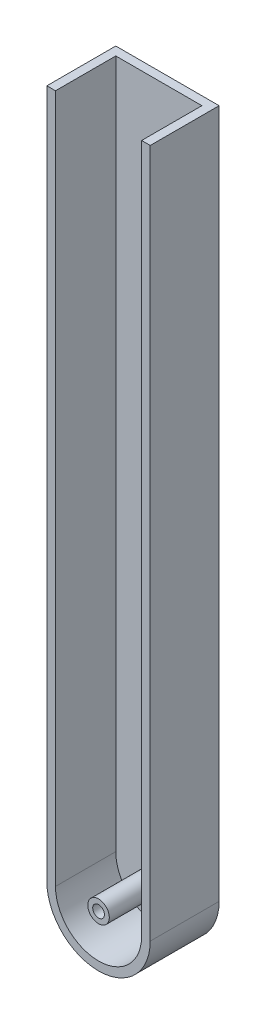
ISO-10303-21;
HEADER;
FILE_DESCRIPTION(('STEP AP214'),'2;1');
FILE_NAME('part.step','',(''),(''),'','','');
FILE_SCHEMA(('AUTOMOTIVE_DESIGN { 1 0 10303 214 1 1 1 1 }'));
ENDSEC;
DATA;
#1=APPLICATION_CONTEXT('core data for automotive mechanical design processes');
#2=APPLICATION_PROTOCOL_DEFINITION('international standard','automotive_design',2000,#1);
#3=PRODUCT_CONTEXT('',#1,'mechanical');
#4=PRODUCT('Part','Part','',(#3));
#5=PRODUCT_RELATED_PRODUCT_CATEGORY('part','',(#4));
#6=PRODUCT_DEFINITION_FORMATION('','',#4);
#7=PRODUCT_DEFINITION_CONTEXT('part definition',#1,'design');
#8=PRODUCT_DEFINITION('design','',#6,#7);
#9=PRODUCT_DEFINITION_SHAPE('','',#8);
#10=(LENGTH_UNIT() NAMED_UNIT(*) SI_UNIT(.MILLI.,.METRE.));
#11=(NAMED_UNIT(*) PLANE_ANGLE_UNIT() SI_UNIT($,.RADIAN.));
#12=(NAMED_UNIT(*) SI_UNIT($,.STERADIAN.) SOLID_ANGLE_UNIT());
#13=UNCERTAINTY_MEASURE_WITH_UNIT(LENGTH_MEASURE(1.E-05),#10,'distance_accuracy_value','');
#14=(GEOMETRIC_REPRESENTATION_CONTEXT(3) GLOBAL_UNCERTAINTY_ASSIGNED_CONTEXT((#13)) GLOBAL_UNIT_ASSIGNED_CONTEXT((#10,
#11,#12)) REPRESENTATION_CONTEXT('',''));
#15=CARTESIAN_POINT('',(0.,0.,0.));
#16=DIRECTION('',(0.,0.,1.));
#17=DIRECTION('',(1.,0.,0.));
#18=AXIS2_PLACEMENT_3D('',#15,#16,#17);
#19=CARTESIAN_POINT('',(6.35,508.,0.));
#20=DIRECTION('',(-1.,0.,0.));
#21=DIRECTION('',(0.,0.,1.));
#22=AXIS2_PLACEMENT_3D('',#19,#20,#21);
#23=PLANE('',#22);
#24=DIRECTION('',(0.,0.,-1.));
#25=VECTOR('',#24,1.);
#26=CARTESIAN_POINT('',(6.35,0.,0.));
#27=LINE('',#26,#25);
#28=CARTESIAN_POINT('',(6.35,0.,0.));
#29=VERTEX_POINT('',#28);
#30=CARTESIAN_POINT('',(6.35,0.,-44.45));
#31=VERTEX_POINT('',#30);
#32=EDGE_CURVE('E134',#29,#31,#27,.T.);
#33=ORIENTED_EDGE('',*,*,#32,.T.);
#34=DIRECTION('',(0.,-1.,0.));
#35=VECTOR('',#34,1.);
#36=CARTESIAN_POINT('',(6.35,508.,-44.45));
#37=LINE('',#36,#35);
#38=CARTESIAN_POINT('',(6.35,508.,-44.45));
#39=VERTEX_POINT('',#38);
#40=EDGE_CURVE('E152',#39,#31,#37,.T.);
#41=ORIENTED_EDGE('',*,*,#40,.F.);
#42=DIRECTION('',(0.,0.,-1.));
#43=VECTOR('',#42,1.);
#44=CARTESIAN_POINT('',(6.35,508.,0.));
#45=LINE('',#44,#43);
#46=CARTESIAN_POINT('',(6.35,508.,0.));
#47=VERTEX_POINT('',#46);
#48=EDGE_CURVE('E94',#47,#39,#45,.T.);
#49=ORIENTED_EDGE('',*,*,#48,.F.);
#50=DIRECTION('',(0.,-1.,0.));
#51=VECTOR('',#50,1.);
#52=CARTESIAN_POINT('',(6.35,508.,0.));
#53=LINE('',#52,#51);
#54=EDGE_CURVE('E47',#47,#29,#53,.T.);
#55=ORIENTED_EDGE('',*,*,#54,.T.);
#56=EDGE_LOOP('',(#33,#41,#49,#55));
#57=FACE_BOUND('',#56,.T.);
#58=ADVANCED_FACE('F39',(#57),#23,.F.);
#59=CARTESIAN_POINT('',(0.,508.,-44.45));
#60=DIRECTION('',(0.,0.,-1.));
#61=DIRECTION('',(-1.,0.,0.));
#62=AXIS2_PLACEMENT_3D('',#59,#60,#61);
#63=PLANE('',#62);
#64=CARTESIAN_POINT('',(38.1,0.,-44.45));
#65=DIRECTION('',(0.,0.,-1.));
#66=DIRECTION('',(-1.,0.,0.));
#67=AXIS2_PLACEMENT_3D('',#64,#65,#66);
#68=CIRCLE('',#67,7.92988147509231);
#69=CARTESIAN_POINT('',(30.1701185249077,0.,-44.45));
#70=VERTEX_POINT('',#69);
#71=EDGE_CURVE('E12',#70,#70,#68,.F.);
#72=ORIENTED_EDGE('',*,*,#71,.F.);
#73=EDGE_LOOP('',(#72));
#74=FACE_BOUND('',#73,.T.);
#75=ORIENTED_EDGE('',*,*,#40,.T.);
#76=CARTESIAN_POINT('',(38.1,0.,-44.45));
#77=DIRECTION('',(0.,0.,-1.));
#78=DIRECTION('',(-1.,0.,0.));
#79=AXIS2_PLACEMENT_3D('',#76,#77,#78);
#80=CIRCLE('',#79,31.75);
#81=CARTESIAN_POINT('',(69.85,0.,-44.45));
#82=VERTEX_POINT('',#81);
#83=EDGE_CURVE('E137',#82,#31,#80,.T.);
#84=ORIENTED_EDGE('',*,*,#83,.F.);
#85=DIRECTION('',(0.,-1.,0.));
#86=VECTOR('',#85,1.);
#87=CARTESIAN_POINT('',(69.85,508.,-44.45));
#88=LINE('',#87,#86);
#89=CARTESIAN_POINT('',(69.85,508.,-44.45));
#90=VERTEX_POINT('',#89);
#91=EDGE_CURVE('E150',#90,#82,#88,.T.);
#92=ORIENTED_EDGE('',*,*,#91,.F.);
#93=DIRECTION('',(1.,0.,0.));
#94=VECTOR('',#93,1.);
#95=CARTESIAN_POINT('',(0.,508.,-44.45));
#96=LINE('',#95,#94);
#97=EDGE_CURVE('E175',#39,#90,#96,.T.);
#98=ORIENTED_EDGE('',*,*,#97,.F.);
#99=EDGE_LOOP('',(#75,#84,#92,#98));
#100=FACE_BOUND('',#99,.T.);
#101=ADVANCED_FACE('F214',(#74,#100),#63,.F.);
#102=CARTESIAN_POINT('',(69.85,508.,0.));
#103=DIRECTION('',(1.,0.,0.));
#104=DIRECTION('',(0.,0.,-1.));
#105=AXIS2_PLACEMENT_3D('',#102,#103,#104);
#106=PLANE('',#105);
#107=DIRECTION('',(0.,0.,1.));
#108=VECTOR('',#107,1.);
#109=CARTESIAN_POINT('',(69.85,0.,0.));
#110=LINE('',#109,#108);
#111=CARTESIAN_POINT('',(69.85,0.,0.));
#112=VERTEX_POINT('',#111);
#113=EDGE_CURVE('E136',#82,#112,#110,.T.);
#114=ORIENTED_EDGE('',*,*,#113,.T.);
#115=DIRECTION('',(0.,-1.,0.));
#116=VECTOR('',#115,1.);
#117=CARTESIAN_POINT('',(69.85,508.,0.));
#118=LINE('',#117,#116);
#119=CARTESIAN_POINT('',(69.85,508.,0.));
#120=VERTEX_POINT('',#119);
#121=EDGE_CURVE('E147',#120,#112,#118,.T.);
#122=ORIENTED_EDGE('',*,*,#121,.F.);
#123=DIRECTION('',(0.,0.,1.));
#124=VECTOR('',#123,1.);
#125=CARTESIAN_POINT('',(69.85,508.,0.));
#126=LINE('',#125,#124);
#127=EDGE_CURVE('E177',#90,#120,#126,.T.);
#128=ORIENTED_EDGE('',*,*,#127,.F.);
#129=ORIENTED_EDGE('',*,*,#91,.T.);
#130=EDGE_LOOP('',(#114,#122,#128,#129));
#131=FACE_BOUND('',#130,.T.);
#132=ADVANCED_FACE('F181',(#131),#106,.F.);
#133=CARTESIAN_POINT('',(0.,508.,0.));
#134=DIRECTION('',(0.,0.,-1.));
#135=DIRECTION('',(-1.,0.,0.));
#136=AXIS2_PLACEMENT_3D('',#133,#134,#135);
#137=PLANE('',#136);
#138=ORIENTED_EDGE('',*,*,#121,.T.);
#139=CARTESIAN_POINT('',(38.1,0.,0.));
#140=DIRECTION('',(0.,0.,-1.));
#141=DIRECTION('',(-1.,0.,0.));
#142=AXIS2_PLACEMENT_3D('',#139,#140,#141);
#143=CIRCLE('',#142,31.75);
#144=EDGE_CURVE('E158',#112,#29,#143,.T.);
#145=ORIENTED_EDGE('',*,*,#144,.T.);
#146=ORIENTED_EDGE('',*,*,#54,.F.);
#147=DIRECTION('',(1.,0.,0.));
#148=VECTOR('',#147,1.);
#149=CARTESIAN_POINT('',(0.,508.,0.));
#150=LINE('',#149,#148);
#151=CARTESIAN_POINT('',(0.,508.,0.));
#152=VERTEX_POINT('',#151);
#153=EDGE_CURVE('E143',#152,#47,#150,.T.);
#154=ORIENTED_EDGE('',*,*,#153,.F.);
#155=DIRECTION('',(0.,-1.,0.));
#156=VECTOR('',#155,1.);
#157=CARTESIAN_POINT('',(0.,508.,0.));
#158=LINE('',#157,#156);
#159=CARTESIAN_POINT('',(0.,0.,0.));
#160=VERTEX_POINT('',#159);
#161=EDGE_CURVE('E55',#152,#160,#158,.T.);
#162=ORIENTED_EDGE('',*,*,#161,.T.);
#163=CARTESIAN_POINT('',(38.1,0.,0.));
#164=DIRECTION('',(0.,0.,-1.));
#165=DIRECTION('',(-1.,0.,0.));
#166=AXIS2_PLACEMENT_3D('',#163,#164,#165);
#167=CIRCLE('',#166,38.1);
#168=CARTESIAN_POINT('',(76.2,0.,0.));
#169=VERTEX_POINT('',#168);
#170=EDGE_CURVE('E163',#169,#160,#167,.T.);
#171=ORIENTED_EDGE('',*,*,#170,.F.);
#172=DIRECTION('',(0.,-1.,0.));
#173=VECTOR('',#172,1.);
#174=CARTESIAN_POINT('',(76.2,508.,0.));
#175=LINE('',#174,#173);
#176=CARTESIAN_POINT('',(76.2,508.,0.));
#177=VERTEX_POINT('',#176);
#178=EDGE_CURVE('E115',#177,#169,#175,.T.);
#179=ORIENTED_EDGE('',*,*,#178,.F.);
#180=DIRECTION('',(1.,0.,0.));
#181=VECTOR('',#180,1.);
#182=CARTESIAN_POINT('',(0.,508.,0.));
#183=LINE('',#182,#181);
#184=EDGE_CURVE('E124',#120,#177,#183,.T.);
#185=ORIENTED_EDGE('',*,*,#184,.F.);
#186=EDGE_LOOP('',(#138,#145,#146,#154,#162,#171,#179,#185));
#187=FACE_BOUND('',#186,.T.);
#188=ADVANCED_FACE('F159',(#187),#137,.F.);
#189=CARTESIAN_POINT('',(76.2,508.,0.));
#190=DIRECTION('',(1.,0.,0.));
#191=DIRECTION('',(0.,0.,-1.));
#192=AXIS2_PLACEMENT_3D('',#189,#190,#191);
#193=PLANE('',#192);
#194=DIRECTION('',(0.,0.,1.));
#195=VECTOR('',#194,1.);
#196=CARTESIAN_POINT('',(76.2,0.,0.));
#197=LINE('',#196,#195);
#198=CARTESIAN_POINT('',(76.2,0.,-50.8));
#199=VERTEX_POINT('',#198);
#200=EDGE_CURVE('E113',#199,#169,#197,.T.);
#201=ORIENTED_EDGE('',*,*,#200,.F.);
#202=DIRECTION('',(0.,-1.,0.));
#203=VECTOR('',#202,1.);
#204=CARTESIAN_POINT('',(76.2,508.,-50.8));
#205=LINE('',#204,#203);
#206=CARTESIAN_POINT('',(76.2,508.,-50.8));
#207=VERTEX_POINT('',#206);
#208=EDGE_CURVE('E83',#207,#199,#205,.T.);
#209=ORIENTED_EDGE('',*,*,#208,.F.);
#210=DIRECTION('',(0.,0.,1.));
#211=VECTOR('',#210,1.);
#212=CARTESIAN_POINT('',(76.2,508.,0.));
#213=LINE('',#212,#211);
#214=EDGE_CURVE('E111',#207,#177,#213,.T.);
#215=ORIENTED_EDGE('',*,*,#214,.T.);
#216=ORIENTED_EDGE('',*,*,#178,.T.);
#217=EDGE_LOOP('',(#201,#209,#215,#216));
#218=FACE_BOUND('',#217,.T.);
#219=ADVANCED_FACE('F110',(#218),#193,.T.);
#220=CARTESIAN_POINT('',(0.,508.,-50.8));
#221=DIRECTION('',(0.,0.,-1.));
#222=DIRECTION('',(-1.,0.,0.));
#223=AXIS2_PLACEMENT_3D('',#220,#221,#222);
#224=PLANE('',#223);
#225=ORIENTED_EDGE('',*,*,#208,.T.);
#226=CARTESIAN_POINT('',(38.1,0.,-50.8));
#227=DIRECTION('',(0.,0.,-1.));
#228=DIRECTION('',(-1.,0.,0.));
#229=AXIS2_PLACEMENT_3D('',#226,#227,#228);
#230=CIRCLE('',#229,38.1);
#231=CARTESIAN_POINT('',(0.,0.,-50.8));
#232=VERTEX_POINT('',#231);
#233=EDGE_CURVE('E184',#199,#232,#230,.T.);
#234=ORIENTED_EDGE('',*,*,#233,.T.);
#235=DIRECTION('',(0.,-1.,0.));
#236=VECTOR('',#235,1.);
#237=CARTESIAN_POINT('',(0.,508.,-50.8));
#238=LINE('',#237,#236);
#239=CARTESIAN_POINT('',(0.,508.,-50.8));
#240=VERTEX_POINT('',#239);
#241=EDGE_CURVE('E116',#240,#232,#238,.T.);
#242=ORIENTED_EDGE('',*,*,#241,.F.);
#243=DIRECTION('',(1.,0.,0.));
#244=VECTOR('',#243,1.);
#245=CARTESIAN_POINT('',(0.,508.,-50.8));
#246=LINE('',#245,#244);
#247=EDGE_CURVE('E122',#240,#207,#246,.T.);
#248=ORIENTED_EDGE('',*,*,#247,.T.);
#249=EDGE_LOOP('',(#225,#234,#242,#248));
#250=FACE_BOUND('',#249,.T.);
#251=ADVANCED_FACE('F127',(#250),#224,.T.);
#252=CARTESIAN_POINT('',(0.,508.,0.));
#253=DIRECTION('',(-1.,0.,0.));
#254=DIRECTION('',(0.,0.,1.));
#255=AXIS2_PLACEMENT_3D('',#252,#253,#254);
#256=PLANE('',#255);
#257=DIRECTION('',(0.,0.,-1.));
#258=VECTOR('',#257,1.);
#259=CARTESIAN_POINT('',(0.,0.,0.));
#260=LINE('',#259,#258);
#261=EDGE_CURVE('E140',#160,#232,#260,.T.);
#262=ORIENTED_EDGE('',*,*,#261,.F.);
#263=ORIENTED_EDGE('',*,*,#161,.F.);
#264=DIRECTION('',(0.,0.,-1.));
#265=VECTOR('',#264,1.);
#266=CARTESIAN_POINT('',(0.,508.,0.));
#267=LINE('',#266,#265);
#268=EDGE_CURVE('E129',#152,#240,#267,.T.);
#269=ORIENTED_EDGE('',*,*,#268,.T.);
#270=ORIENTED_EDGE('',*,*,#241,.T.);
#271=EDGE_LOOP('',(#262,#263,#269,#270));
#272=FACE_BOUND('',#271,.T.);
#273=ADVANCED_FACE('F228',(#272),#256,.T.);
#274=CARTESIAN_POINT('',(0.,508.,0.));
#275=DIRECTION('',(0.,1.,0.));
#276=DIRECTION('',(0.,0.,1.));
#277=AXIS2_PLACEMENT_3D('',#274,#275,#276);
#278=PLANE('',#277);
#279=ORIENTED_EDGE('',*,*,#153,.T.);
#280=ORIENTED_EDGE('',*,*,#48,.T.);
#281=ORIENTED_EDGE('',*,*,#97,.T.);
#282=ORIENTED_EDGE('',*,*,#127,.T.);
#283=ORIENTED_EDGE('',*,*,#184,.T.);
#284=ORIENTED_EDGE('',*,*,#214,.F.);
#285=ORIENTED_EDGE('',*,*,#247,.F.);
#286=ORIENTED_EDGE('',*,*,#268,.F.);
#287=EDGE_LOOP('',(#279,#280,#281,#282,#283,#284,#285,#286));
#288=FACE_BOUND('',#287,.T.);
#289=ADVANCED_FACE('F120',(#288),#278,.T.);
#290=CARTESIAN_POINT('',(38.1,0.,-50.8));
#291=DIRECTION('',(0.,0.,-1.));
#292=DIRECTION('',(-1.,0.,0.));
#293=AXIS2_PLACEMENT_3D('',#290,#291,#292);
#294=CYLINDRICAL_SURFACE('',#293,31.75);
#295=ORIENTED_EDGE('',*,*,#144,.F.);
#296=ORIENTED_EDGE('',*,*,#113,.F.);
#297=ORIENTED_EDGE('',*,*,#83,.T.);
#298=ORIENTED_EDGE('',*,*,#32,.F.);
#299=EDGE_LOOP('',(#295,#296,#297,#298));
#300=FACE_BOUND('',#299,.T.);
#301=ADVANCED_FACE('F166',(#300),#294,.F.);
#302=CARTESIAN_POINT('',(38.1,0.,-50.8));
#303=DIRECTION('',(0.,0.,-1.));
#304=DIRECTION('',(-1.,0.,0.));
#305=AXIS2_PLACEMENT_3D('',#302,#303,#304);
#306=CYLINDRICAL_SURFACE('',#305,38.1);
#307=ORIENTED_EDGE('',*,*,#200,.T.);
#308=ORIENTED_EDGE('',*,*,#170,.T.);
#309=ORIENTED_EDGE('',*,*,#261,.T.);
#310=ORIENTED_EDGE('',*,*,#233,.F.);
#311=EDGE_LOOP('',(#307,#308,#309,#310));
#312=FACE_BOUND('',#311,.T.);
#313=ADVANCED_FACE('F185',(#312),#306,.T.);
#314=CARTESIAN_POINT('',(38.1,0.,22.4290918601734));
#315=DIRECTION('',(0.,0.,-1.));
#316=DIRECTION('',(-1.,0.,0.));
#317=AXIS2_PLACEMENT_3D('',#314,#315,#316);
#318=CYLINDRICAL_SURFACE('',#317,7.92988147509231);
#319=CARTESIAN_POINT('',(38.1,0.,0.));
#320=DIRECTION('',(0.,0.,-1.));
#321=DIRECTION('',(-1.,0.,0.));
#322=AXIS2_PLACEMENT_3D('',#319,#320,#321);
#323=CIRCLE('',#322,7.92988147509231);
#324=CARTESIAN_POINT('',(30.1701185249077,0.,0.));
#325=VERTEX_POINT('',#324);
#326=EDGE_CURVE('E186',#325,#325,#323,.T.);
#327=ORIENTED_EDGE('',*,*,#326,.T.);
#328=EDGE_LOOP('',(#327));
#329=FACE_BOUND('',#328,.T.);
#330=ORIENTED_EDGE('',*,*,#71,.T.);
#331=EDGE_LOOP('',(#330));
#332=FACE_BOUND('',#331,.T.);
#333=ADVANCED_FACE('F205',(#329,#332),#318,.T.);
#334=CARTESIAN_POINT('',(0.,508.,0.));
#335=DIRECTION('',(0.,0.,-1.));
#336=DIRECTION('',(-1.,0.,0.));
#337=AXIS2_PLACEMENT_3D('',#334,#335,#336);
#338=PLANE('',#337);
#339=CARTESIAN_POINT('',(38.1,0.,0.));
#340=DIRECTION('',(0.,0.,1.));
#341=DIRECTION('',(1.,0.,0.));
#342=AXIS2_PLACEMENT_3D('',#339,#340,#341);
#343=CIRCLE('',#342,4.30972172017209);
#344=CARTESIAN_POINT('',(42.4097217201721,0.,0.));
#345=VERTEX_POINT('',#344);
#346=EDGE_CURVE('E194',#345,#345,#343,.T.);
#347=ORIENTED_EDGE('',*,*,#346,.F.);
#348=EDGE_LOOP('',(#347));
#349=FACE_BOUND('',#348,.T.);
#350=ORIENTED_EDGE('',*,*,#326,.F.);
#351=EDGE_LOOP('',(#350));
#352=FACE_BOUND('',#351,.T.);
#353=ADVANCED_FACE('F201',(#349,#352),#338,.F.);
#354=CARTESIAN_POINT('',(0.,508.,-44.45));
#355=DIRECTION('',(0.,0.,-1.));
#356=DIRECTION('',(-1.,0.,0.));
#357=AXIS2_PLACEMENT_3D('',#354,#355,#356);
#358=PLANE('',#357);
#359=CARTESIAN_POINT('',(38.1,0.,-44.45));
#360=DIRECTION('',(0.,0.,-1.));
#361=DIRECTION('',(-1.,0.,0.));
#362=AXIS2_PLACEMENT_3D('',#359,#360,#361);
#363=CIRCLE('',#362,4.30972172017209);
#364=CARTESIAN_POINT('',(33.7902782798279,0.,-44.45));
#365=VERTEX_POINT('',#364);
#366=EDGE_CURVE('E189',#365,#365,#363,.F.);
#367=ORIENTED_EDGE('',*,*,#366,.T.);
#368=EDGE_LOOP('',(#367));
#369=FACE_BOUND('',#368,.T.);
#370=ADVANCED_FACE('F204',(#369),#358,.F.);
#371=CARTESIAN_POINT('',(38.1,0.,-62.9897338134426));
#372=DIRECTION('',(0.,0.,1.));
#373=DIRECTION('',(1.,0.,0.));
#374=AXIS2_PLACEMENT_3D('',#371,#372,#373);
#375=CYLINDRICAL_SURFACE('',#374,4.30972172017209);
#376=ORIENTED_EDGE('',*,*,#346,.T.);
#377=EDGE_LOOP('',(#376));
#378=FACE_BOUND('',#377,.T.);
#379=ORIENTED_EDGE('',*,*,#366,.F.);
#380=EDGE_LOOP('',(#379));
#381=FACE_BOUND('',#380,.T.);
#382=ADVANCED_FACE('F198',(#378,#381),#375,.F.);
#383=CLOSED_SHELL('',(#58,#101,#132,#188,#219,#251,#273,#289,#301,#313,#333,#353,#370,#382));
#384=MANIFOLD_SOLID_BREP('B2',#383);
#385=ADVANCED_BREP_SHAPE_REPRESENTATION('',(#18,#384),#14);
#386=SHAPE_DEFINITION_REPRESENTATION(#9,#385);
ENDSEC;
END-ISO-10303-21;
